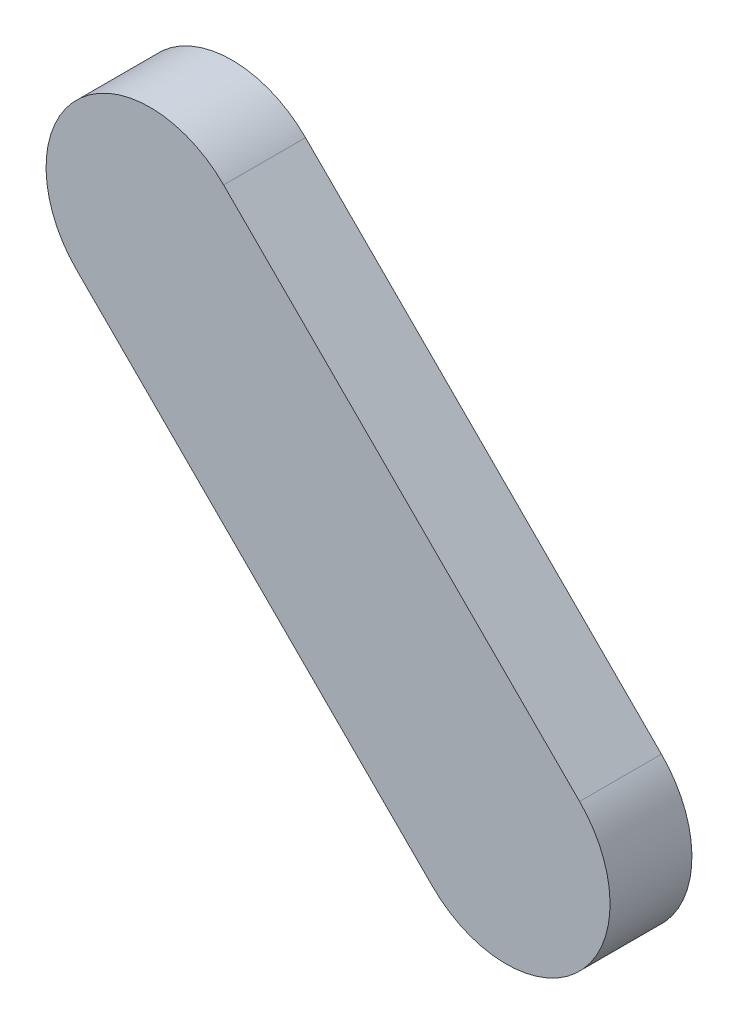
ISO-10303-21;
HEADER;
FILE_DESCRIPTION(('STEP AP214'),'2;1');
FILE_NAME('part.step','',(''),(''),'','','');
FILE_SCHEMA(('AUTOMOTIVE_DESIGN { 1 0 10303 214 1 1 1 1 }'));
ENDSEC;
DATA;
#1=APPLICATION_CONTEXT('core data for automotive mechanical design processes');
#2=APPLICATION_PROTOCOL_DEFINITION('international standard','automotive_design',2000,#1);
#3=PRODUCT_CONTEXT('',#1,'mechanical');
#4=PRODUCT('Part','Part','',(#3));
#5=PRODUCT_RELATED_PRODUCT_CATEGORY('part','',(#4));
#6=PRODUCT_DEFINITION_FORMATION('','',#4);
#7=PRODUCT_DEFINITION_CONTEXT('part definition',#1,'design');
#8=PRODUCT_DEFINITION('design','',#6,#7);
#9=PRODUCT_DEFINITION_SHAPE('','',#8);
#10=(LENGTH_UNIT() NAMED_UNIT(*) SI_UNIT(.MILLI.,.METRE.));
#11=(NAMED_UNIT(*) PLANE_ANGLE_UNIT() SI_UNIT($,.RADIAN.));
#12=(NAMED_UNIT(*) SI_UNIT($,.STERADIAN.) SOLID_ANGLE_UNIT());
#13=UNCERTAINTY_MEASURE_WITH_UNIT(LENGTH_MEASURE(1.E-05),#10,'distance_accuracy_value','');
#14=(GEOMETRIC_REPRESENTATION_CONTEXT(3) GLOBAL_UNCERTAINTY_ASSIGNED_CONTEXT((#13)) GLOBAL_UNIT_ASSIGNED_CONTEXT((#10,
#11,#12)) REPRESENTATION_CONTEXT('',''));
#15=CARTESIAN_POINT('',(0.,0.,0.));
#16=DIRECTION('',(0.,0.,1.));
#17=DIRECTION('',(1.,0.,0.));
#18=AXIS2_PLACEMENT_3D('',#15,#16,#17);
#19=CARTESIAN_POINT('',(91.46359406,68.63468366,0.));
#20=DIRECTION('',(0.707106781186548,0.707106781186548,0.));
#21=DIRECTION('',(0.707106781186548,-0.707106781186548,0.));
#22=AXIS2_PLACEMENT_3D('',#19,#20,#21);
#23=PLANE('',#22);
#24=DIRECTION('',(0.707106781186548,-0.707106781186548,0.));
#25=VECTOR('',#24,1.);
#26=CARTESIAN_POINT('',(91.46359406,68.63468366,0.1999996));
#27=LINE('',#26,#25);
#28=CARTESIAN_POINT('',(91.46359406,68.63468366,0.1999996));
#29=VERTEX_POINT('',#28);
#30=CARTESIAN_POINT('',(92.33288366,67.76539406,0.1999996));
#31=VERTEX_POINT('',#30);
#32=EDGE_CURVE('E11',#29,#31,#27,.T.);
#33=ORIENTED_EDGE('',*,*,#32,.F.);
#34=DIRECTION('',(0.,0.,1.));
#35=VECTOR('',#34,1.);
#36=CARTESIAN_POINT('',(91.46359406,68.63468366,0.));
#37=LINE('',#36,#35);
#38=CARTESIAN_POINT('',(91.46359406,68.63468366,0.));
#39=VERTEX_POINT('',#38);
#40=EDGE_CURVE('E24',#39,#29,#37,.T.);
#41=ORIENTED_EDGE('',*,*,#40,.F.);
#42=DIRECTION('',(0.707106781186548,-0.707106781186548,0.));
#43=VECTOR('',#42,1.);
#44=CARTESIAN_POINT('',(91.46359406,68.63468366,0.));
#45=LINE('',#44,#43);
#46=CARTESIAN_POINT('',(92.33288366,67.76539406,0.));
#47=VERTEX_POINT('',#46);
#48=EDGE_CURVE('E75',#39,#47,#45,.T.);
#49=ORIENTED_EDGE('',*,*,#48,.T.);
#50=DIRECTION('',(0.,0.,1.));
#51=VECTOR('',#50,1.);
#52=CARTESIAN_POINT('',(92.33288366,67.76539406,0.));
#53=LINE('',#52,#51);
#54=EDGE_CURVE('E37',#47,#31,#53,.T.);
#55=ORIENTED_EDGE('',*,*,#54,.T.);
#56=EDGE_LOOP('',(#33,#41,#49,#55));
#57=FACE_BOUND('',#56,.T.);
#58=ADVANCED_FACE('F17',(#57),#23,.F.);
#59=CARTESIAN_POINT('',(92.5124896,67.945,0.));
#60=DIRECTION('',(0.,0.,-1.));
#61=DIRECTION('',(-0.707106781186548,-0.707106781186548,0.));
#62=AXIS2_PLACEMENT_3D('',#59,#60,#61);
#63=CYLINDRICAL_SURFACE('',#62,0.254001156230774);
#64=CARTESIAN_POINT('',(92.5124896,67.945,0.1999996));
#65=DIRECTION('',(0.,0.,1.));
#66=DIRECTION('',(-0.707106781186548,-0.707106781186548,0.));
#67=AXIS2_PLACEMENT_3D('',#64,#65,#66);
#68=CIRCLE('',#67,0.254001156230774);
#69=CARTESIAN_POINT('',(92.69209554,68.12460594,0.1999996));
#70=VERTEX_POINT('',#69);
#71=EDGE_CURVE('E83',#31,#70,#68,.T.);
#72=ORIENTED_EDGE('',*,*,#71,.F.);
#73=ORIENTED_EDGE('',*,*,#54,.F.);
#74=CARTESIAN_POINT('',(92.5124896,67.945,0.));
#75=DIRECTION('',(0.,0.,1.));
#76=DIRECTION('',(-0.707106781186548,-0.707106781186548,0.));
#77=AXIS2_PLACEMENT_3D('',#74,#75,#76);
#78=CIRCLE('',#77,0.254001156230774);
#79=CARTESIAN_POINT('',(92.69209554,68.12460594,0.));
#80=VERTEX_POINT('',#79);
#81=EDGE_CURVE('E81',#47,#80,#78,.T.);
#82=ORIENTED_EDGE('',*,*,#81,.T.);
#83=DIRECTION('',(0.,0.,1.));
#84=VECTOR('',#83,1.);
#85=CARTESIAN_POINT('',(92.69209554,68.12460594,0.));
#86=LINE('',#85,#84);
#87=EDGE_CURVE('E67',#80,#70,#86,.T.);
#88=ORIENTED_EDGE('',*,*,#87,.T.);
#89=EDGE_LOOP('',(#72,#73,#82,#88));
#90=FACE_BOUND('',#89,.T.);
#91=ADVANCED_FACE('F89',(#90),#63,.T.);
#92=CARTESIAN_POINT('',(92.69209554,68.12460594,0.));
#93=DIRECTION('',(-0.707106781186542,-0.707106781186553,0.));
#94=DIRECTION('',(-0.707106781186553,0.707106781186542,0.));
#95=AXIS2_PLACEMENT_3D('',#92,#93,#94);
#96=PLANE('',#95);
#97=DIRECTION('',(-0.707106781186553,0.707106781186542,0.));
#98=VECTOR('',#97,1.);
#99=CARTESIAN_POINT('',(92.69209554,68.12460594,0.1999996));
#100=LINE('',#99,#98);
#101=CARTESIAN_POINT('',(91.82280594,68.99389554,0.1999996));
#102=VERTEX_POINT('',#101);
#103=EDGE_CURVE('E71',#70,#102,#100,.T.);
#104=ORIENTED_EDGE('',*,*,#103,.F.);
#105=ORIENTED_EDGE('',*,*,#87,.F.);
#106=DIRECTION('',(-0.707106781186553,0.707106781186542,0.));
#107=VECTOR('',#106,1.);
#108=CARTESIAN_POINT('',(92.69209554,68.12460594,0.));
#109=LINE('',#108,#107);
#110=CARTESIAN_POINT('',(91.82280594,68.99389554,0.));
#111=VERTEX_POINT('',#110);
#112=EDGE_CURVE('E63',#80,#111,#109,.T.);
#113=ORIENTED_EDGE('',*,*,#112,.T.);
#114=DIRECTION('',(0.,0.,1.));
#115=VECTOR('',#114,1.);
#116=CARTESIAN_POINT('',(91.82280594,68.99389554,0.));
#117=LINE('',#116,#115);
#118=EDGE_CURVE('E53',#111,#102,#117,.T.);
#119=ORIENTED_EDGE('',*,*,#118,.T.);
#120=EDGE_LOOP('',(#104,#105,#113,#119));
#121=FACE_BOUND('',#120,.T.);
#122=ADVANCED_FACE('F66',(#121),#96,.F.);
#123=CARTESIAN_POINT('',(91.6432,68.8142896,0.));
#124=DIRECTION('',(0.,0.,-1.));
#125=DIRECTION('',(0.707106781186548,0.707106781186548,0.));
#126=AXIS2_PLACEMENT_3D('',#123,#124,#125);
#127=CYLINDRICAL_SURFACE('',#126,0.254001156230771);
#128=CARTESIAN_POINT('',(91.6432,68.8142896,0.1999996));
#129=DIRECTION('',(0.,0.,1.));
#130=DIRECTION('',(0.707106781186548,0.707106781186548,0.));
#131=AXIS2_PLACEMENT_3D('',#128,#129,#130);
#132=CIRCLE('',#131,0.254001156230771);
#133=EDGE_CURVE('E59',#102,#29,#132,.T.);
#134=ORIENTED_EDGE('',*,*,#133,.F.);
#135=ORIENTED_EDGE('',*,*,#118,.F.);
#136=CARTESIAN_POINT('',(91.6432,68.8142896,0.));
#137=DIRECTION('',(0.,0.,1.));
#138=DIRECTION('',(0.707106781186548,0.707106781186548,0.));
#139=AXIS2_PLACEMENT_3D('',#136,#137,#138);
#140=CIRCLE('',#139,0.254001156230771);
#141=EDGE_CURVE('E57',#111,#39,#140,.T.);
#142=ORIENTED_EDGE('',*,*,#141,.T.);
#143=ORIENTED_EDGE('',*,*,#40,.T.);
#144=EDGE_LOOP('',(#134,#135,#142,#143));
#145=FACE_BOUND('',#144,.T.);
#146=ADVANCED_FACE('F55',(#145),#127,.T.);
#147=CARTESIAN_POINT('',(91.46359406,68.63468366,0.));
#148=DIRECTION('',(0.,0.,-1.));
#149=DIRECTION('',(-1.,0.,0.));
#150=AXIS2_PLACEMENT_3D('',#147,#148,#149);
#151=PLANE('',#150);
#152=ORIENTED_EDGE('',*,*,#141,.F.);
#153=ORIENTED_EDGE('',*,*,#112,.F.);
#154=ORIENTED_EDGE('',*,*,#81,.F.);
#155=ORIENTED_EDGE('',*,*,#48,.F.);
#156=EDGE_LOOP('',(#152,#153,#154,#155));
#157=FACE_BOUND('',#156,.T.);
#158=ADVANCED_FACE('F74',(#157),#151,.T.);
#159=CARTESIAN_POINT('',(91.46359406,68.63468366,0.1999996));
#160=DIRECTION('',(0.,0.,-1.));
#161=DIRECTION('',(-1.,0.,0.));
#162=AXIS2_PLACEMENT_3D('',#159,#160,#161);
#163=PLANE('',#162);
#164=ORIENTED_EDGE('',*,*,#32,.T.);
#165=ORIENTED_EDGE('',*,*,#71,.T.);
#166=ORIENTED_EDGE('',*,*,#103,.T.);
#167=ORIENTED_EDGE('',*,*,#133,.T.);
#168=EDGE_LOOP('',(#164,#165,#166,#167));
#169=FACE_BOUND('',#168,.T.);
#170=ADVANCED_FACE('F91',(#169),#163,.F.);
#171=CLOSED_SHELL('',(#58,#91,#122,#146,#158,#170));
#172=MANIFOLD_SOLID_BREP('B1',#171);
#173=ADVANCED_BREP_SHAPE_REPRESENTATION('',(#18,#172),#14);
#174=SHAPE_DEFINITION_REPRESENTATION(#9,#173);
ENDSEC;
END-ISO-10303-21;
